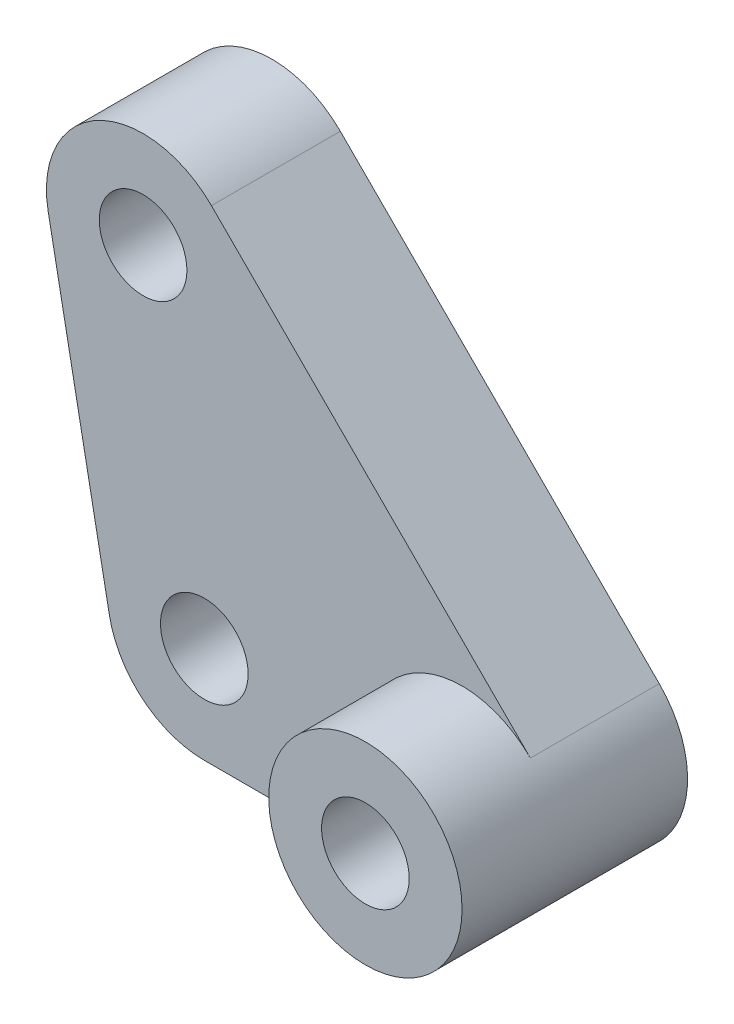
ISO-10303-21;
HEADER;
FILE_DESCRIPTION(('STEP AP214'),'2;1');
FILE_NAME('part.step','',(''),(''),'','','');
FILE_SCHEMA(('AUTOMOTIVE_DESIGN { 1 0 10303 214 1 1 1 1 }'));
ENDSEC;
DATA;
#1=APPLICATION_CONTEXT('core data for automotive mechanical design processes');
#2=APPLICATION_PROTOCOL_DEFINITION('international standard','automotive_design',2000,#1);
#3=PRODUCT_CONTEXT('',#1,'mechanical');
#4=PRODUCT('Part','Part','',(#3));
#5=PRODUCT_RELATED_PRODUCT_CATEGORY('part','',(#4));
#6=PRODUCT_DEFINITION_FORMATION('','',#4);
#7=PRODUCT_DEFINITION_CONTEXT('part definition',#1,'design');
#8=PRODUCT_DEFINITION('design','',#6,#7);
#9=PRODUCT_DEFINITION_SHAPE('','',#8);
#10=(LENGTH_UNIT() NAMED_UNIT(*) SI_UNIT(.MILLI.,.METRE.));
#11=(NAMED_UNIT(*) PLANE_ANGLE_UNIT() SI_UNIT($,.RADIAN.));
#12=(NAMED_UNIT(*) SI_UNIT($,.STERADIAN.) SOLID_ANGLE_UNIT());
#13=UNCERTAINTY_MEASURE_WITH_UNIT(LENGTH_MEASURE(1.E-05),#10,'distance_accuracy_value','');
#14=(GEOMETRIC_REPRESENTATION_CONTEXT(3) GLOBAL_UNCERTAINTY_ASSIGNED_CONTEXT((#13)) GLOBAL_UNIT_ASSIGNED_CONTEXT((#10,
#11,#12)) REPRESENTATION_CONTEXT('',''));
#15=CARTESIAN_POINT('',(0.,0.,0.));
#16=DIRECTION('',(0.,0.,1.));
#17=DIRECTION('',(1.,0.,0.));
#18=AXIS2_PLACEMENT_3D('',#15,#16,#17);
#19=CARTESIAN_POINT('',(0.,0.,3.175));
#20=DIRECTION('',(0.,0.,1.));
#21=DIRECTION('',(1.,0.,0.));
#22=AXIS2_PLACEMENT_3D('',#19,#20,#21);
#23=PLANE('',#22);
#24=CARTESIAN_POINT('',(-12.7,0.,3.175));
#25=DIRECTION('',(0.,0.,1.));
#26=DIRECTION('',(1.,0.,0.));
#27=AXIS2_PLACEMENT_3D('',#24,#25,#26);
#28=CIRCLE('',#27,2.159);
#29=CARTESIAN_POINT('',(-10.541,0.,3.175));
#30=VERTEX_POINT('',#29);
#31=EDGE_CURVE('E149',#30,#30,#28,.T.);
#32=ORIENTED_EDGE('',*,*,#31,.F.);
#33=EDGE_LOOP('',(#32));
#34=FACE_BOUND('',#33,.T.);
#35=CARTESIAN_POINT('',(-15.715448211871,15.715448211871,3.175));
#36=DIRECTION('',(0.,0.,1.));
#37=DIRECTION('',(1.,0.,0.));
#38=AXIS2_PLACEMENT_3D('',#35,#36,#37);
#39=CIRCLE('',#38,2.159);
#40=CARTESIAN_POINT('',(-13.556448211871,15.715448211871,3.175));
#41=VERTEX_POINT('',#40);
#42=EDGE_CURVE('E198',#41,#41,#39,.T.);
#43=ORIENTED_EDGE('',*,*,#42,.F.);
#44=EDGE_LOOP('',(#43));
#45=FACE_BOUND('',#44,.T.);
#46=DIRECTION('',(1.,0.,0.));
#47=VECTOR('',#46,1.);
#48=CARTESIAN_POINT('',(0.,-4.7625,3.175));
#49=LINE('',#48,#47);
#50=CARTESIAN_POINT('',(-12.7,-4.7625,3.175));
#51=VERTEX_POINT('',#50);
#52=CARTESIAN_POINT('',(0.,-4.7625,3.175));
#53=VERTEX_POINT('',#52);
#54=EDGE_CURVE('E68',#51,#53,#49,.T.);
#55=ORIENTED_EDGE('',*,*,#54,.T.);
#56=CARTESIAN_POINT('',(0.,0.,3.175));
#57=DIRECTION('',(0.,0.,1.));
#58=DIRECTION('',(1.,0.,0.));
#59=AXIS2_PLACEMENT_3D('',#56,#57,#58);
#60=CIRCLE('',#59,4.7625);
#61=CARTESIAN_POINT('',(3.36759604540094,3.36759604540093,3.175));
#62=VERTEX_POINT('',#61);
#63=EDGE_CURVE('E182',#53,#62,#60,.F.);
#64=ORIENTED_EDGE('',*,*,#63,.T.);
#65=DIRECTION('',(-0.707106781186546,0.707106781186549,0.));
#66=VECTOR('',#65,1.);
#67=CARTESIAN_POINT('',(3.36759604540094,3.36759604540093,3.175));
#68=LINE('',#67,#66);
#69=CARTESIAN_POINT('',(-12.3478521664701,19.083044257272,3.175));
#70=VERTEX_POINT('',#69);
#71=EDGE_CURVE('E111',#62,#70,#68,.T.);
#72=ORIENTED_EDGE('',*,*,#71,.T.);
#73=CARTESIAN_POINT('',(-15.715448211871,15.715448211871,3.175));
#74=DIRECTION('',(0.,0.,1.));
#75=DIRECTION('',(1.,0.,0.));
#76=AXIS2_PLACEMENT_3D('',#73,#74,#75);
#77=CIRCLE('',#76,4.7625);
#78=CARTESIAN_POINT('',(-20.3926262512648,14.8180008107312,3.175));
#79=VERTEX_POINT('',#78);
#80=EDGE_CURVE('E123',#70,#79,#77,.T.);
#81=ORIENTED_EDGE('',*,*,#80,.T.);
#82=DIRECTION('',(0.188440399189478,-0.982084627694228,0.));
#83=VECTOR('',#82,1.);
#84=CARTESIAN_POINT('',(-20.3926262512648,14.8180008107312,3.175));
#85=LINE('',#84,#83);
#86=CARTESIAN_POINT('',(-17.3771780393938,-0.897447401139889,3.175));
#87=VERTEX_POINT('',#86);
#88=EDGE_CURVE('E118',#79,#87,#85,.T.);
#89=ORIENTED_EDGE('',*,*,#88,.T.);
#90=CARTESIAN_POINT('',(-12.7,0.,3.175));
#91=DIRECTION('',(0.,0.,1.));
#92=DIRECTION('',(1.,0.,0.));
#93=AXIS2_PLACEMENT_3D('',#90,#91,#92);
#94=CIRCLE('',#93,4.7625);
#95=EDGE_CURVE('E121',#87,#51,#94,.T.);
#96=ORIENTED_EDGE('',*,*,#95,.T.);
#97=EDGE_LOOP('',(#55,#64,#72,#81,#89,#96));
#98=FACE_BOUND('',#97,.T.);
#99=ADVANCED_FACE('F47',(#34,#45,#98),#23,.T.);
#100=CARTESIAN_POINT('',(0.,0.,-3.175));
#101=DIRECTION('',(0.,0.,1.));
#102=DIRECTION('',(1.,0.,0.));
#103=AXIS2_PLACEMENT_3D('',#100,#101,#102);
#104=PLANE('',#103);
#105=CARTESIAN_POINT('',(0.,0.,-3.175));
#106=DIRECTION('',(0.,0.,1.));
#107=DIRECTION('',(1.,0.,0.));
#108=AXIS2_PLACEMENT_3D('',#105,#106,#107);
#109=CIRCLE('',#108,4.7625);
#110=CARTESIAN_POINT('',(0.,-4.7625,-3.175));
#111=VERTEX_POINT('',#110);
#112=CARTESIAN_POINT('',(3.36759604540094,3.36759604540093,-3.175));
#113=VERTEX_POINT('',#112);
#114=EDGE_CURVE('E145',#111,#113,#109,.T.);
#115=ORIENTED_EDGE('',*,*,#114,.F.);
#116=DIRECTION('',(1.,0.,0.));
#117=VECTOR('',#116,1.);
#118=CARTESIAN_POINT('',(0.,-4.7625,-3.175));
#119=LINE('',#118,#117);
#120=CARTESIAN_POINT('',(-12.7,-4.7625,-3.175));
#121=VERTEX_POINT('',#120);
#122=EDGE_CURVE('E159',#121,#111,#119,.T.);
#123=ORIENTED_EDGE('',*,*,#122,.F.);
#124=CARTESIAN_POINT('',(-12.7,0.,-3.175));
#125=DIRECTION('',(0.,0.,1.));
#126=DIRECTION('',(1.,0.,0.));
#127=AXIS2_PLACEMENT_3D('',#124,#125,#126);
#128=CIRCLE('',#127,4.7625);
#129=CARTESIAN_POINT('',(-17.3771780393938,-0.897447401139889,-3.175));
#130=VERTEX_POINT('',#129);
#131=EDGE_CURVE('E97',#130,#121,#128,.T.);
#132=ORIENTED_EDGE('',*,*,#131,.F.);
#133=DIRECTION('',(0.188440399189478,-0.982084627694228,0.));
#134=VECTOR('',#133,1.);
#135=CARTESIAN_POINT('',(-20.3926262512648,14.8180008107312,-3.175));
#136=LINE('',#135,#134);
#137=CARTESIAN_POINT('',(-20.3926262512648,14.8180008107312,-3.175));
#138=VERTEX_POINT('',#137);
#139=EDGE_CURVE('E132',#138,#130,#136,.T.);
#140=ORIENTED_EDGE('',*,*,#139,.F.);
#141=CARTESIAN_POINT('',(-15.715448211871,15.715448211871,-3.175));
#142=DIRECTION('',(0.,0.,1.));
#143=DIRECTION('',(1.,0.,0.));
#144=AXIS2_PLACEMENT_3D('',#141,#142,#143);
#145=CIRCLE('',#144,4.7625);
#146=CARTESIAN_POINT('',(-12.3478521664701,19.083044257272,-3.175));
#147=VERTEX_POINT('',#146);
#148=EDGE_CURVE('E152',#147,#138,#145,.T.);
#149=ORIENTED_EDGE('',*,*,#148,.F.);
#150=DIRECTION('',(-0.707106781186546,0.707106781186549,0.));
#151=VECTOR('',#150,1.);
#152=CARTESIAN_POINT('',(3.36759604540094,3.36759604540093,-3.175));
#153=LINE('',#152,#151);
#154=EDGE_CURVE('E148',#113,#147,#153,.T.);
#155=ORIENTED_EDGE('',*,*,#154,.F.);
#156=EDGE_LOOP('',(#115,#123,#132,#140,#149,#155));
#157=FACE_BOUND('',#156,.T.);
#158=CARTESIAN_POINT('',(-12.7,0.,-3.175));
#159=DIRECTION('',(0.,0.,1.));
#160=DIRECTION('',(1.,0.,0.));
#161=AXIS2_PLACEMENT_3D('',#158,#159,#160);
#162=CIRCLE('',#161,2.159);
#163=CARTESIAN_POINT('',(-10.541,0.,-3.175));
#164=VERTEX_POINT('',#163);
#165=EDGE_CURVE('E202',#164,#164,#162,.T.);
#166=ORIENTED_EDGE('',*,*,#165,.T.);
#167=EDGE_LOOP('',(#166));
#168=FACE_BOUND('',#167,.T.);
#169=CARTESIAN_POINT('',(-15.715448211871,15.715448211871,-3.175));
#170=DIRECTION('',(0.,0.,1.));
#171=DIRECTION('',(1.,0.,0.));
#172=AXIS2_PLACEMENT_3D('',#169,#170,#171);
#173=CIRCLE('',#172,2.159);
#174=CARTESIAN_POINT('',(-13.556448211871,15.715448211871,-3.175));
#175=VERTEX_POINT('',#174);
#176=EDGE_CURVE('E190',#175,#175,#173,.T.);
#177=ORIENTED_EDGE('',*,*,#176,.T.);
#178=EDGE_LOOP('',(#177));
#179=FACE_BOUND('',#178,.T.);
#180=CARTESIAN_POINT('',(0.,0.,-3.175));
#181=DIRECTION('',(0.,0.,1.));
#182=DIRECTION('',(1.,0.,0.));
#183=AXIS2_PLACEMENT_3D('',#180,#181,#182);
#184=CIRCLE('',#183,2.159);
#185=CARTESIAN_POINT('',(2.159,0.,-3.175));
#186=VERTEX_POINT('',#185);
#187=EDGE_CURVE('E185',#186,#186,#184,.T.);
#188=ORIENTED_EDGE('',*,*,#187,.T.);
#189=EDGE_LOOP('',(#188));
#190=FACE_BOUND('',#189,.T.);
#191=ADVANCED_FACE('F176',(#157,#168,#179,#190),#104,.F.);
#192=CARTESIAN_POINT('',(0.,0.,3.175));
#193=DIRECTION('',(0.,0.,-1.));
#194=DIRECTION('',(-1.,0.,0.));
#195=AXIS2_PLACEMENT_3D('',#192,#193,#194);
#196=CYLINDRICAL_SURFACE('',#195,4.7625);
#197=DIRECTION('',(0.,0.,-1.));
#198=VECTOR('',#197,1.);
#199=CARTESIAN_POINT('',(0.,-4.7625,3.175));
#200=LINE('',#199,#198);
#201=EDGE_CURVE('E104',#53,#111,#200,.T.);
#202=ORIENTED_EDGE('',*,*,#201,.T.);
#203=ORIENTED_EDGE('',*,*,#114,.T.);
#204=DIRECTION('',(0.,0.,-1.));
#205=VECTOR('',#204,1.);
#206=CARTESIAN_POINT('',(3.36759604540094,3.36759604540093,3.175));
#207=LINE('',#206,#205);
#208=EDGE_CURVE('E11',#62,#113,#207,.T.);
#209=ORIENTED_EDGE('',*,*,#208,.F.);
#210=ORIENTED_EDGE('',*,*,#63,.F.);
#211=EDGE_LOOP('',(#202,#203,#209,#210));
#212=FACE_BOUND('',#211,.T.);
#213=CARTESIAN_POINT('',(0.,0.,7.9375));
#214=DIRECTION('',(0.,0.,1.));
#215=DIRECTION('',(1.,0.,0.));
#216=AXIS2_PLACEMENT_3D('',#213,#214,#215);
#217=CIRCLE('',#216,4.7625);
#218=CARTESIAN_POINT('',(4.7625,0.,7.9375));
#219=VERTEX_POINT('',#218);
#220=EDGE_CURVE('E186',#219,#219,#217,.T.);
#221=ORIENTED_EDGE('',*,*,#220,.F.);
#222=EDGE_LOOP('',(#221));
#223=FACE_BOUND('',#222,.T.);
#224=ADVANCED_FACE('F49',(#212,#223),#196,.T.);
#225=CARTESIAN_POINT('',(3.36759604540094,3.36759604540093,3.175));
#226=DIRECTION('',(-0.707106781186549,-0.707106781186546,0.));
#227=DIRECTION('',(0.707106781186546,-0.707106781186549,0.));
#228=AXIS2_PLACEMENT_3D('',#225,#226,#227);
#229=PLANE('',#228);
#230=ORIENTED_EDGE('',*,*,#154,.T.);
#231=DIRECTION('',(0.,0.,-1.));
#232=VECTOR('',#231,1.);
#233=CARTESIAN_POINT('',(-12.3478521664701,19.083044257272,3.175));
#234=LINE('',#233,#232);
#235=EDGE_CURVE('E57',#70,#147,#234,.T.);
#236=ORIENTED_EDGE('',*,*,#235,.F.);
#237=ORIENTED_EDGE('',*,*,#71,.F.);
#238=ORIENTED_EDGE('',*,*,#208,.T.);
#239=EDGE_LOOP('',(#230,#236,#237,#238));
#240=FACE_BOUND('',#239,.T.);
#241=ADVANCED_FACE('F242',(#240),#229,.F.);
#242=CARTESIAN_POINT('',(-15.715448211871,15.715448211871,3.175));
#243=DIRECTION('',(0.,0.,-1.));
#244=DIRECTION('',(-1.,0.,0.));
#245=AXIS2_PLACEMENT_3D('',#242,#243,#244);
#246=CYLINDRICAL_SURFACE('',#245,4.7625);
#247=ORIENTED_EDGE('',*,*,#148,.T.);
#248=DIRECTION('',(0.,0.,-1.));
#249=VECTOR('',#248,1.);
#250=CARTESIAN_POINT('',(-20.3926262512648,14.8180008107312,3.175));
#251=LINE('',#250,#249);
#252=EDGE_CURVE('E134',#79,#138,#251,.T.);
#253=ORIENTED_EDGE('',*,*,#252,.F.);
#254=ORIENTED_EDGE('',*,*,#80,.F.);
#255=ORIENTED_EDGE('',*,*,#235,.T.);
#256=EDGE_LOOP('',(#247,#253,#254,#255));
#257=FACE_BOUND('',#256,.T.);
#258=ADVANCED_FACE('F171',(#257),#246,.T.);
#259=CARTESIAN_POINT('',(-20.3926262512648,14.8180008107312,3.175));
#260=DIRECTION('',(0.982084627694228,0.188440399189478,0.));
#261=DIRECTION('',(-0.188440399189478,0.982084627694228,0.));
#262=AXIS2_PLACEMENT_3D('',#259,#260,#261);
#263=PLANE('',#262);
#264=ORIENTED_EDGE('',*,*,#139,.T.);
#265=DIRECTION('',(0.,0.,-1.));
#266=VECTOR('',#265,1.);
#267=CARTESIAN_POINT('',(-17.3771780393938,-0.897447401139889,3.175));
#268=LINE('',#267,#266);
#269=EDGE_CURVE('E129',#87,#130,#268,.T.);
#270=ORIENTED_EDGE('',*,*,#269,.F.);
#271=ORIENTED_EDGE('',*,*,#88,.F.);
#272=ORIENTED_EDGE('',*,*,#252,.T.);
#273=EDGE_LOOP('',(#264,#270,#271,#272));
#274=FACE_BOUND('',#273,.T.);
#275=ADVANCED_FACE('F130',(#274),#263,.F.);
#276=CARTESIAN_POINT('',(-12.7,0.,3.175));
#277=DIRECTION('',(0.,0.,-1.));
#278=DIRECTION('',(-1.,0.,0.));
#279=AXIS2_PLACEMENT_3D('',#276,#277,#278);
#280=CYLINDRICAL_SURFACE('',#279,4.7625);
#281=ORIENTED_EDGE('',*,*,#131,.T.);
#282=DIRECTION('',(0.,0.,-1.));
#283=VECTOR('',#282,1.);
#284=CARTESIAN_POINT('',(-12.7,-4.7625,3.175));
#285=LINE('',#284,#283);
#286=EDGE_CURVE('E135',#51,#121,#285,.T.);
#287=ORIENTED_EDGE('',*,*,#286,.F.);
#288=ORIENTED_EDGE('',*,*,#95,.F.);
#289=ORIENTED_EDGE('',*,*,#269,.T.);
#290=EDGE_LOOP('',(#281,#287,#288,#289));
#291=FACE_BOUND('',#290,.T.);
#292=ADVANCED_FACE('F137',(#291),#280,.T.);
#293=CARTESIAN_POINT('',(0.,-4.7625,3.175));
#294=DIRECTION('',(0.,1.,0.));
#295=DIRECTION('',(0.,0.,1.));
#296=AXIS2_PLACEMENT_3D('',#293,#294,#295);
#297=PLANE('',#296);
#298=ORIENTED_EDGE('',*,*,#122,.T.);
#299=ORIENTED_EDGE('',*,*,#201,.F.);
#300=ORIENTED_EDGE('',*,*,#54,.F.);
#301=ORIENTED_EDGE('',*,*,#286,.T.);
#302=EDGE_LOOP('',(#298,#299,#300,#301));
#303=FACE_BOUND('',#302,.T.);
#304=ADVANCED_FACE('F180',(#303),#297,.F.);
#305=CARTESIAN_POINT('',(-12.7,0.,3.175));
#306=DIRECTION('',(0.,0.,-1.));
#307=DIRECTION('',(-1.,0.,0.));
#308=AXIS2_PLACEMENT_3D('',#305,#306,#307);
#309=CYLINDRICAL_SURFACE('',#308,2.159);
#310=ORIENTED_EDGE('',*,*,#31,.T.);
#311=EDGE_LOOP('',(#310));
#312=FACE_BOUND('',#311,.T.);
#313=ORIENTED_EDGE('',*,*,#165,.F.);
#314=EDGE_LOOP('',(#313));
#315=FACE_BOUND('',#314,.T.);
#316=ADVANCED_FACE('F216',(#312,#315),#309,.F.);
#317=CARTESIAN_POINT('',(-15.715448211871,15.715448211871,3.175));
#318=DIRECTION('',(0.,0.,-1.));
#319=DIRECTION('',(-1.,0.,0.));
#320=AXIS2_PLACEMENT_3D('',#317,#318,#319);
#321=CYLINDRICAL_SURFACE('',#320,2.159);
#322=ORIENTED_EDGE('',*,*,#42,.T.);
#323=EDGE_LOOP('',(#322));
#324=FACE_BOUND('',#323,.T.);
#325=ORIENTED_EDGE('',*,*,#176,.F.);
#326=EDGE_LOOP('',(#325));
#327=FACE_BOUND('',#326,.T.);
#328=ADVANCED_FACE('F218',(#324,#327),#321,.F.);
#329=CARTESIAN_POINT('',(0.,0.,3.175));
#330=DIRECTION('',(0.,0.,-1.));
#331=DIRECTION('',(-1.,0.,0.));
#332=AXIS2_PLACEMENT_3D('',#329,#330,#331);
#333=CYLINDRICAL_SURFACE('',#332,2.159);
#334=ORIENTED_EDGE('',*,*,#187,.F.);
#335=EDGE_LOOP('',(#334));
#336=FACE_BOUND('',#335,.T.);
#337=CARTESIAN_POINT('',(0.,0.,7.9375));
#338=DIRECTION('',(0.,0.,1.));
#339=DIRECTION('',(1.,0.,0.));
#340=AXIS2_PLACEMENT_3D('',#337,#338,#339);
#341=CIRCLE('',#340,2.159);
#342=CARTESIAN_POINT('',(2.159,0.,7.9375));
#343=VERTEX_POINT('',#342);
#344=EDGE_CURVE('E194',#343,#343,#341,.T.);
#345=ORIENTED_EDGE('',*,*,#344,.T.);
#346=EDGE_LOOP('',(#345));
#347=FACE_BOUND('',#346,.T.);
#348=ADVANCED_FACE('F224',(#336,#347),#333,.F.);
#349=CARTESIAN_POINT('',(0.,0.,7.9375));
#350=DIRECTION('',(0.,0.,1.));
#351=DIRECTION('',(1.,0.,0.));
#352=AXIS2_PLACEMENT_3D('',#349,#350,#351);
#353=PLANE('',#352);
#354=ORIENTED_EDGE('',*,*,#220,.T.);
#355=EDGE_LOOP('',(#354));
#356=FACE_BOUND('',#355,.T.);
#357=ORIENTED_EDGE('',*,*,#344,.F.);
#358=EDGE_LOOP('',(#357));
#359=FACE_BOUND('',#358,.T.);
#360=ADVANCED_FACE('F256',(#356,#359),#353,.T.);
#361=CLOSED_SHELL('',(#99,#191,#224,#241,#258,#275,#292,#304,#316,#328,#348,#360));
#362=MANIFOLD_SOLID_BREP('B2',#361);
#363=ADVANCED_BREP_SHAPE_REPRESENTATION('',(#18,#362),#14);
#364=SHAPE_DEFINITION_REPRESENTATION(#9,#363);
ENDSEC;
END-ISO-10303-21;
